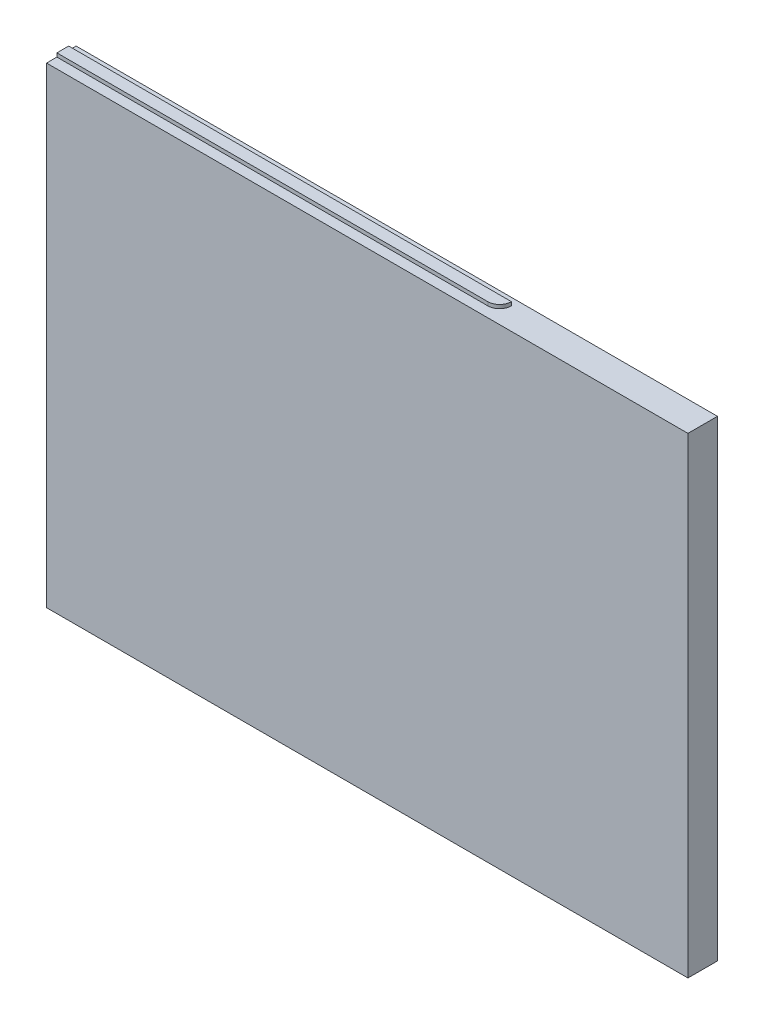
ISO-10303-21;
HEADER;
FILE_DESCRIPTION(('STEP AP214'),'2;1');
FILE_NAME('part.step','',(''),(''),'','','');
FILE_SCHEMA(('AUTOMOTIVE_DESIGN { 1 0 10303 214 1 1 1 1 }'));
ENDSEC;
DATA;
#1=APPLICATION_CONTEXT('core data for automotive mechanical design processes');
#2=APPLICATION_PROTOCOL_DEFINITION('international standard','automotive_design',2000,#1);
#3=PRODUCT_CONTEXT('',#1,'mechanical');
#4=PRODUCT('Part','Part','',(#3));
#5=PRODUCT_RELATED_PRODUCT_CATEGORY('part','',(#4));
#6=PRODUCT_DEFINITION_FORMATION('','',#4);
#7=PRODUCT_DEFINITION_CONTEXT('part definition',#1,'design');
#8=PRODUCT_DEFINITION('design','',#6,#7);
#9=PRODUCT_DEFINITION_SHAPE('','',#8);
#10=(LENGTH_UNIT() NAMED_UNIT(*) SI_UNIT(.MILLI.,.METRE.));
#11=(NAMED_UNIT(*) PLANE_ANGLE_UNIT() SI_UNIT($,.RADIAN.));
#12=(NAMED_UNIT(*) SI_UNIT($,.STERADIAN.) SOLID_ANGLE_UNIT());
#13=UNCERTAINTY_MEASURE_WITH_UNIT(LENGTH_MEASURE(1.E-05),#10,'distance_accuracy_value','');
#14=(GEOMETRIC_REPRESENTATION_CONTEXT(3) GLOBAL_UNCERTAINTY_ASSIGNED_CONTEXT((#13)) GLOBAL_UNIT_ASSIGNED_CONTEXT((#10,
#11,#12)) REPRESENTATION_CONTEXT('',''));
#15=CARTESIAN_POINT('',(0.,0.,0.));
#16=DIRECTION('',(0.,0.,1.));
#17=DIRECTION('',(1.,0.,0.));
#18=AXIS2_PLACEMENT_3D('',#15,#16,#17);
#19=CARTESIAN_POINT('',(-67.1291659251601,-122.720727580372,10.));
#20=DIRECTION('',(0.,1.,0.));
#21=DIRECTION('',(0.,0.,1.));
#22=AXIS2_PLACEMENT_3D('',#19,#20,#21);
#23=PLANE('',#22);
#24=DIRECTION('',(1.,0.,0.));
#25=VECTOR('',#24,1.);
#26=CARTESIAN_POINT('',(-67.1291659251601,-122.720727580372,2.5));
#27=LINE('',#26,#25);
#28=CARTESIAN_POINT('',(-67.1291659251601,-122.720727580372,2.5));
#29=VERTEX_POINT('',#28);
#30=CARTESIAN_POINT('',(82.8708340748399,-122.720727580372,2.5));
#31=VERTEX_POINT('',#30);
#32=EDGE_CURVE('E166',#29,#31,#27,.T.);
#33=ORIENTED_EDGE('',*,*,#32,.F.);
#34=DIRECTION('',(0.,0.,-1.));
#35=VECTOR('',#34,1.);
#36=CARTESIAN_POINT('',(-67.1291659251601,-122.720727580372,10.));
#37=LINE('',#36,#35);
#38=CARTESIAN_POINT('',(-67.1291659251601,-122.720727580372,0.));
#39=VERTEX_POINT('',#38);
#40=EDGE_CURVE('E197',#29,#39,#37,.T.);
#41=ORIENTED_EDGE('',*,*,#40,.T.);
#42=DIRECTION('',(1.,0.,0.));
#43=VECTOR('',#42,1.);
#44=CARTESIAN_POINT('',(-67.1291659251601,-122.720727580372,0.));
#45=LINE('',#44,#43);
#46=CARTESIAN_POINT('',(150.17083407484,-122.720727580372,0.));
#47=VERTEX_POINT('',#46);
#48=EDGE_CURVE('E183',#39,#47,#45,.T.);
#49=ORIENTED_EDGE('',*,*,#48,.T.);
#50=DIRECTION('',(0.,0.,-1.));
#51=VECTOR('',#50,1.);
#52=CARTESIAN_POINT('',(150.17083407484,-122.720727580372,10.));
#53=LINE('',#52,#51);
#54=CARTESIAN_POINT('',(150.17083407484,-122.720727580372,10.));
#55=VERTEX_POINT('',#54);
#56=EDGE_CURVE('E194',#55,#47,#53,.T.);
#57=ORIENTED_EDGE('',*,*,#56,.F.);
#58=DIRECTION('',(1.,0.,0.));
#59=VECTOR('',#58,1.);
#60=CARTESIAN_POINT('',(-67.1291659251601,-122.720727580372,10.));
#61=LINE('',#60,#59);
#62=CARTESIAN_POINT('',(-67.1291659251601,-122.720727580372,10.));
#63=VERTEX_POINT('',#62);
#64=EDGE_CURVE('E173',#63,#55,#61,.T.);
#65=ORIENTED_EDGE('',*,*,#64,.F.);
#66=CARTESIAN_POINT('',(-67.1291659251601,-122.720727580372,6.5));
#67=VERTEX_POINT('',#66);
#68=EDGE_CURVE('E198',#63,#67,#37,.T.);
#69=ORIENTED_EDGE('',*,*,#68,.T.);
#70=DIRECTION('',(1.,0.,0.));
#71=VECTOR('',#70,1.);
#72=CARTESIAN_POINT('',(-67.1291659251601,-122.720727580372,6.5));
#73=LINE('',#72,#71);
#74=CARTESIAN_POINT('',(78.8708340748399,-122.720727580372,6.5));
#75=VERTEX_POINT('',#74);
#76=EDGE_CURVE('E163',#67,#75,#73,.T.);
#77=ORIENTED_EDGE('',*,*,#76,.T.);
#78=CARTESIAN_POINT('',(78.8708340748399,-122.720727580372,2.5));
#79=DIRECTION('',(0.,1.,0.));
#80=DIRECTION('',(0.,0.,1.));
#81=AXIS2_PLACEMENT_3D('',#78,#79,#80);
#82=CIRCLE('',#81,4.);
#83=EDGE_CURVE('E209',#75,#31,#82,.T.);
#84=ORIENTED_EDGE('',*,*,#83,.T.);
#85=EDGE_LOOP('',(#33,#41,#49,#57,#65,#69,#77,#84));
#86=FACE_BOUND('',#85,.T.);
#87=ADVANCED_FACE('F35',(#86),#23,.F.);
#88=CARTESIAN_POINT('',(-67.1291659251601,37.0792724196278,10.));
#89=DIRECTION('',(0.,-1.,0.));
#90=DIRECTION('',(0.,0.,-1.));
#91=AXIS2_PLACEMENT_3D('',#88,#89,#90);
#92=PLANE('',#91);
#93=DIRECTION('',(-1.,0.,0.));
#94=VECTOR('',#93,1.);
#95=CARTESIAN_POINT('',(-67.1291659251601,37.0792724196278,2.5));
#96=LINE('',#95,#94);
#97=CARTESIAN_POINT('',(82.8708340748399,37.0792724196278,2.5));
#98=VERTEX_POINT('',#97);
#99=CARTESIAN_POINT('',(-67.1291659251601,37.0792724196278,2.5));
#100=VERTEX_POINT('',#99);
#101=EDGE_CURVE('E127',#98,#100,#96,.T.);
#102=ORIENTED_EDGE('',*,*,#101,.F.);
#103=CARTESIAN_POINT('',(78.8708340748399,37.0792724196278,2.5));
#104=DIRECTION('',(0.,-1.,0.));
#105=DIRECTION('',(0.,0.,-1.));
#106=AXIS2_PLACEMENT_3D('',#103,#104,#105);
#107=CIRCLE('',#106,4.);
#108=CARTESIAN_POINT('',(78.8708340748399,37.0792724196278,6.5));
#109=VERTEX_POINT('',#108);
#110=EDGE_CURVE('E11',#98,#109,#107,.T.);
#111=ORIENTED_EDGE('',*,*,#110,.T.);
#112=DIRECTION('',(-1.,0.,0.));
#113=VECTOR('',#112,1.);
#114=CARTESIAN_POINT('',(-67.1291659251601,37.0792724196278,6.5));
#115=LINE('',#114,#113);
#116=CARTESIAN_POINT('',(-67.1291659251601,37.0792724196278,6.5));
#117=VERTEX_POINT('',#116);
#118=EDGE_CURVE('E201',#109,#117,#115,.T.);
#119=ORIENTED_EDGE('',*,*,#118,.T.);
#120=DIRECTION('',(0.,0.,-1.));
#121=VECTOR('',#120,1.);
#122=CARTESIAN_POINT('',(-67.1291659251601,37.0792724196278,10.));
#123=LINE('',#122,#121);
#124=CARTESIAN_POINT('',(-67.1291659251601,37.0792724196278,10.));
#125=VERTEX_POINT('',#124);
#126=EDGE_CURVE('E189',#125,#117,#123,.T.);
#127=ORIENTED_EDGE('',*,*,#126,.F.);
#128=DIRECTION('',(-1.,0.,0.));
#129=VECTOR('',#128,1.);
#130=CARTESIAN_POINT('',(-67.1291659251601,37.0792724196278,10.));
#131=LINE('',#130,#129);
#132=CARTESIAN_POINT('',(150.17083407484,37.0792724196278,10.));
#133=VERTEX_POINT('',#132);
#134=EDGE_CURVE('E178',#133,#125,#131,.T.);
#135=ORIENTED_EDGE('',*,*,#134,.F.);
#136=DIRECTION('',(0.,0.,-1.));
#137=VECTOR('',#136,1.);
#138=CARTESIAN_POINT('',(150.17083407484,37.0792724196278,10.));
#139=LINE('',#138,#137);
#140=CARTESIAN_POINT('',(150.17083407484,37.0792724196278,0.));
#141=VERTEX_POINT('',#140);
#142=EDGE_CURVE('E191',#133,#141,#139,.T.);
#143=ORIENTED_EDGE('',*,*,#142,.T.);
#144=DIRECTION('',(-1.,0.,0.));
#145=VECTOR('',#144,1.);
#146=CARTESIAN_POINT('',(-67.1291659251601,37.0792724196278,0.));
#147=LINE('',#146,#145);
#148=CARTESIAN_POINT('',(-67.1291659251601,37.0792724196278,0.));
#149=VERTEX_POINT('',#148);
#150=EDGE_CURVE('E174',#141,#149,#147,.T.);
#151=ORIENTED_EDGE('',*,*,#150,.T.);
#152=EDGE_CURVE('E180',#100,#149,#123,.T.);
#153=ORIENTED_EDGE('',*,*,#152,.F.);
#154=EDGE_LOOP('',(#102,#111,#119,#127,#135,#143,#151,#153));
#155=FACE_BOUND('',#154,.T.);
#156=ADVANCED_FACE('F214',(#155),#92,.F.);
#157=CARTESIAN_POINT('',(-67.1291659251601,37.0792724196278,10.));
#158=DIRECTION('',(1.,0.,0.));
#159=DIRECTION('',(0.,1.,0.));
#160=AXIS2_PLACEMENT_3D('',#157,#158,#159);
#161=PLANE('',#160);
#162=ORIENTED_EDGE('',*,*,#126,.T.);
#163=DIRECTION('',(0.,1.,0.));
#164=VECTOR('',#163,1.);
#165=CARTESIAN_POINT('',(-67.1291659251601,-123.960727580372,6.5));
#166=LINE('',#165,#164);
#167=CARTESIAN_POINT('',(-67.1291659251601,38.3192724196278,6.5));
#168=VERTEX_POINT('',#167);
#169=EDGE_CURVE('E144',#117,#168,#166,.T.);
#170=ORIENTED_EDGE('',*,*,#169,.T.);
#171=DIRECTION('',(0.,0.,-1.));
#172=VECTOR('',#171,1.);
#173=CARTESIAN_POINT('',(-67.1291659251601,38.3192724196278,6.5));
#174=LINE('',#173,#172);
#175=CARTESIAN_POINT('',(-67.1291659251601,38.3192724196278,2.5));
#176=VERTEX_POINT('',#175);
#177=EDGE_CURVE('E138',#168,#176,#174,.T.);
#178=ORIENTED_EDGE('',*,*,#177,.T.);
#179=DIRECTION('',(0.,1.,0.));
#180=VECTOR('',#179,1.);
#181=CARTESIAN_POINT('',(-67.1291659251601,-123.960727580372,2.5));
#182=LINE('',#181,#180);
#183=EDGE_CURVE('E123',#100,#176,#182,.T.);
#184=ORIENTED_EDGE('',*,*,#183,.F.);
#185=ORIENTED_EDGE('',*,*,#152,.T.);
#186=DIRECTION('',(0.,-1.,0.));
#187=VECTOR('',#186,1.);
#188=CARTESIAN_POINT('',(-67.1291659251601,37.0792724196278,0.));
#189=LINE('',#188,#187);
#190=EDGE_CURVE('E169',#149,#39,#189,.T.);
#191=ORIENTED_EDGE('',*,*,#190,.T.);
#192=ORIENTED_EDGE('',*,*,#40,.F.);
#193=CARTESIAN_POINT('',(-67.1291659251601,-123.960727580372,2.5));
#194=VERTEX_POINT('',#193);
#195=EDGE_CURVE('E131',#194,#29,#182,.T.);
#196=ORIENTED_EDGE('',*,*,#195,.F.);
#197=DIRECTION('',(0.,0.,-1.));
#198=VECTOR('',#197,1.);
#199=CARTESIAN_POINT('',(-67.1291659251601,-123.960727580372,6.5));
#200=LINE('',#199,#198);
#201=CARTESIAN_POINT('',(-67.1291659251601,-123.960727580372,6.5));
#202=VERTEX_POINT('',#201);
#203=EDGE_CURVE('E149',#202,#194,#200,.T.);
#204=ORIENTED_EDGE('',*,*,#203,.F.);
#205=EDGE_CURVE('E157',#202,#67,#166,.T.);
#206=ORIENTED_EDGE('',*,*,#205,.T.);
#207=ORIENTED_EDGE('',*,*,#68,.F.);
#208=DIRECTION('',(0.,-1.,0.));
#209=VECTOR('',#208,1.);
#210=CARTESIAN_POINT('',(-67.1291659251601,37.0792724196278,10.));
#211=LINE('',#210,#209);
#212=EDGE_CURVE('E170',#125,#63,#211,.T.);
#213=ORIENTED_EDGE('',*,*,#212,.F.);
#214=EDGE_LOOP('',(#162,#170,#178,#184,#185,#191,#192,#196,#204,#206,#207,#213));
#215=FACE_BOUND('',#214,.T.);
#216=ADVANCED_FACE('F142',(#215),#161,.F.);
#217=CARTESIAN_POINT('',(150.17083407484,37.0792724196278,10.));
#218=DIRECTION('',(-1.,0.,0.));
#219=DIRECTION('',(0.,-1.,0.));
#220=AXIS2_PLACEMENT_3D('',#217,#218,#219);
#221=PLANE('',#220);
#222=DIRECTION('',(0.,1.,0.));
#223=VECTOR('',#222,1.);
#224=CARTESIAN_POINT('',(150.17083407484,37.0792724196278,0.));
#225=LINE('',#224,#223);
#226=EDGE_CURVE('E185',#47,#141,#225,.T.);
#227=ORIENTED_EDGE('',*,*,#226,.T.);
#228=ORIENTED_EDGE('',*,*,#142,.F.);
#229=DIRECTION('',(0.,1.,0.));
#230=VECTOR('',#229,1.);
#231=CARTESIAN_POINT('',(150.17083407484,37.0792724196278,10.));
#232=LINE('',#231,#230);
#233=EDGE_CURVE('E176',#55,#133,#232,.T.);
#234=ORIENTED_EDGE('',*,*,#233,.F.);
#235=ORIENTED_EDGE('',*,*,#56,.T.);
#236=EDGE_LOOP('',(#227,#228,#234,#235));
#237=FACE_BOUND('',#236,.T.);
#238=ADVANCED_FACE('F228',(#237),#221,.F.);
#239=CARTESIAN_POINT('',(0.,0.,10.));
#240=DIRECTION('',(0.,0.,1.));
#241=DIRECTION('',(1.,0.,0.));
#242=AXIS2_PLACEMENT_3D('',#239,#240,#241);
#243=PLANE('',#242);
#244=ORIENTED_EDGE('',*,*,#212,.T.);
#245=ORIENTED_EDGE('',*,*,#64,.T.);
#246=ORIENTED_EDGE('',*,*,#233,.T.);
#247=ORIENTED_EDGE('',*,*,#134,.T.);
#248=EDGE_LOOP('',(#244,#245,#246,#247));
#249=FACE_BOUND('',#248,.T.);
#250=ADVANCED_FACE('F232',(#249),#243,.T.);
#251=CARTESIAN_POINT('',(0.,0.,0.));
#252=DIRECTION('',(0.,0.,1.));
#253=DIRECTION('',(1.,0.,0.));
#254=AXIS2_PLACEMENT_3D('',#251,#252,#253);
#255=PLANE('',#254);
#256=ORIENTED_EDGE('',*,*,#190,.F.);
#257=ORIENTED_EDGE('',*,*,#150,.F.);
#258=ORIENTED_EDGE('',*,*,#226,.F.);
#259=ORIENTED_EDGE('',*,*,#48,.F.);
#260=EDGE_LOOP('',(#256,#257,#258,#259));
#261=FACE_BOUND('',#260,.T.);
#262=ADVANCED_FACE('F221',(#261),#255,.F.);
#263=CARTESIAN_POINT('',(0.,38.3192724196278,0.));
#264=DIRECTION('',(0.,-1.,0.));
#265=DIRECTION('',(0.,0.,-1.));
#266=AXIS2_PLACEMENT_3D('',#263,#264,#265);
#267=PLANE('',#266);
#268=DIRECTION('',(1.,0.,0.));
#269=VECTOR('',#268,1.);
#270=CARTESIAN_POINT('',(-67.1291659251601,38.3192724196278,6.5));
#271=LINE('',#270,#269);
#272=CARTESIAN_POINT('',(78.8708340748399,38.3192724196278,6.5));
#273=VERTEX_POINT('',#272);
#274=EDGE_CURVE('E139',#168,#273,#271,.T.);
#275=ORIENTED_EDGE('',*,*,#274,.T.);
#276=CARTESIAN_POINT('',(78.8708340748399,38.3192724196278,2.5));
#277=DIRECTION('',(0.,-1.,0.));
#278=DIRECTION('',(0.,0.,-1.));
#279=AXIS2_PLACEMENT_3D('',#276,#277,#278);
#280=CIRCLE('',#279,4.);
#281=CARTESIAN_POINT('',(82.8708340748399,38.3192724196278,2.5));
#282=VERTEX_POINT('',#281);
#283=EDGE_CURVE('E43',#273,#282,#280,.F.);
#284=ORIENTED_EDGE('',*,*,#283,.T.);
#285=DIRECTION('',(1.,0.,0.));
#286=VECTOR('',#285,1.);
#287=CARTESIAN_POINT('',(-67.1291659251601,38.3192724196278,2.5));
#288=LINE('',#287,#286);
#289=EDGE_CURVE('E126',#176,#282,#288,.T.);
#290=ORIENTED_EDGE('',*,*,#289,.F.);
#291=ORIENTED_EDGE('',*,*,#177,.F.);
#292=EDGE_LOOP('',(#275,#284,#290,#291));
#293=FACE_BOUND('',#292,.T.);
#294=ADVANCED_FACE('F137',(#293),#267,.F.);
#295=CARTESIAN_POINT('',(-67.1291659251601,-123.960727580372,6.5));
#296=DIRECTION('',(0.,0.,1.));
#297=DIRECTION('',(1.,0.,0.));
#298=AXIS2_PLACEMENT_3D('',#295,#296,#297);
#299=PLANE('',#298);
#300=ORIENTED_EDGE('',*,*,#118,.F.);
#301=DIRECTION('',(0.,1.,0.));
#302=VECTOR('',#301,1.);
#303=CARTESIAN_POINT('',(78.8708340748399,-123.960727580372,6.5));
#304=LINE('',#303,#302);
#305=EDGE_CURVE('E211',#109,#273,#304,.T.);
#306=ORIENTED_EDGE('',*,*,#305,.T.);
#307=ORIENTED_EDGE('',*,*,#274,.F.);
#308=ORIENTED_EDGE('',*,*,#169,.F.);
#309=EDGE_LOOP('',(#300,#306,#307,#308));
#310=FACE_BOUND('',#309,.T.);
#311=ADVANCED_FACE('F213',(#310),#299,.T.);
#312=CARTESIAN_POINT('',(-67.1291659251601,-123.960727580372,2.5));
#313=DIRECTION('',(0.,0.,1.));
#314=DIRECTION('',(1.,0.,0.));
#315=AXIS2_PLACEMENT_3D('',#312,#313,#314);
#316=PLANE('',#315);
#317=DIRECTION('',(0.,1.,0.));
#318=VECTOR('',#317,1.);
#319=CARTESIAN_POINT('',(82.8708340748399,-123.960727580372,2.5));
#320=LINE('',#319,#318);
#321=EDGE_CURVE('E160',#98,#282,#320,.T.);
#322=ORIENTED_EDGE('',*,*,#321,.F.);
#323=ORIENTED_EDGE('',*,*,#101,.T.);
#324=ORIENTED_EDGE('',*,*,#183,.T.);
#325=ORIENTED_EDGE('',*,*,#289,.T.);
#326=EDGE_LOOP('',(#322,#323,#324,#325));
#327=FACE_BOUND('',#326,.T.);
#328=ADVANCED_FACE('F125',(#327),#316,.F.);
#329=ORIENTED_EDGE('',*,*,#195,.T.);
#330=ORIENTED_EDGE('',*,*,#32,.T.);
#331=CARTESIAN_POINT('',(82.8708340748399,-123.960727580372,2.5));
#332=VERTEX_POINT('',#331);
#333=EDGE_CURVE('E132',#332,#31,#320,.T.);
#334=ORIENTED_EDGE('',*,*,#333,.F.);
#335=DIRECTION('',(1.,0.,0.));
#336=VECTOR('',#335,1.);
#337=CARTESIAN_POINT('',(-67.1291659251601,-123.960727580372,2.5));
#338=LINE('',#337,#336);
#339=EDGE_CURVE('E152',#194,#332,#338,.T.);
#340=ORIENTED_EDGE('',*,*,#339,.F.);
#341=EDGE_LOOP('',(#329,#330,#334,#340));
#342=FACE_BOUND('',#341,.T.);
#343=ADVANCED_FACE('F246',(#342),#316,.F.);
#344=DIRECTION('',(1.,0.,0.));
#345=VECTOR('',#344,1.);
#346=CARTESIAN_POINT('',(-67.1291659251601,-123.960727580372,6.5));
#347=LINE('',#346,#345);
#348=CARTESIAN_POINT('',(78.8708340748399,-123.960727580372,6.5));
#349=VERTEX_POINT('',#348);
#350=EDGE_CURVE('E154',#202,#349,#347,.T.);
#351=ORIENTED_EDGE('',*,*,#350,.T.);
#352=DIRECTION('',(0.,1.,0.));
#353=VECTOR('',#352,1.);
#354=CARTESIAN_POINT('',(78.8708340748399,-123.960727580372,6.5));
#355=LINE('',#354,#353);
#356=EDGE_CURVE('E204',#349,#75,#355,.T.);
#357=ORIENTED_EDGE('',*,*,#356,.T.);
#358=ORIENTED_EDGE('',*,*,#76,.F.);
#359=ORIENTED_EDGE('',*,*,#205,.F.);
#360=EDGE_LOOP('',(#351,#357,#358,#359));
#361=FACE_BOUND('',#360,.T.);
#362=ADVANCED_FACE('F239',(#361),#299,.T.);
#363=CARTESIAN_POINT('',(0.,-123.960727580372,0.));
#364=DIRECTION('',(0.,-1.,0.));
#365=DIRECTION('',(0.,0.,-1.));
#366=AXIS2_PLACEMENT_3D('',#363,#364,#365);
#367=PLANE('',#366);
#368=ORIENTED_EDGE('',*,*,#339,.T.);
#369=CARTESIAN_POINT('',(78.8708340748399,-123.960727580372,2.5));
#370=DIRECTION('',(0.,-1.,0.));
#371=DIRECTION('',(0.,0.,-1.));
#372=AXIS2_PLACEMENT_3D('',#369,#370,#371);
#373=CIRCLE('',#372,4.);
#374=EDGE_CURVE('E207',#332,#349,#373,.T.);
#375=ORIENTED_EDGE('',*,*,#374,.T.);
#376=ORIENTED_EDGE('',*,*,#350,.F.);
#377=ORIENTED_EDGE('',*,*,#203,.T.);
#378=EDGE_LOOP('',(#368,#375,#376,#377));
#379=FACE_BOUND('',#378,.T.);
#380=ADVANCED_FACE('F248',(#379),#367,.T.);
#381=CARTESIAN_POINT('',(78.8708340748399,-123.960727580372,2.5));
#382=DIRECTION('',(0.,1.,0.));
#383=DIRECTION('',(0.,0.,1.));
#384=AXIS2_PLACEMENT_3D('',#381,#382,#383);
#385=CYLINDRICAL_SURFACE('',#384,4.);
#386=ORIENTED_EDGE('',*,*,#374,.F.);
#387=ORIENTED_EDGE('',*,*,#333,.T.);
#388=ORIENTED_EDGE('',*,*,#83,.F.);
#389=ORIENTED_EDGE('',*,*,#356,.F.);
#390=EDGE_LOOP('',(#386,#387,#388,#389));
#391=FACE_BOUND('',#390,.T.);
#392=ADVANCED_FACE('F243',(#391),#385,.T.);
#393=CARTESIAN_POINT('',(78.8708340748399,-123.960727580372,2.5));
#394=DIRECTION('',(0.,1.,0.));
#395=DIRECTION('',(0.,0.,1.));
#396=AXIS2_PLACEMENT_3D('',#393,#394,#395);
#397=CYLINDRICAL_SURFACE('',#396,4.);
#398=ORIENTED_EDGE('',*,*,#110,.F.);
#399=ORIENTED_EDGE('',*,*,#321,.T.);
#400=ORIENTED_EDGE('',*,*,#283,.F.);
#401=ORIENTED_EDGE('',*,*,#305,.F.);
#402=EDGE_LOOP('',(#398,#399,#400,#401));
#403=FACE_BOUND('',#402,.T.);
#404=ADVANCED_FACE('F37',(#403),#397,.T.);
#405=CLOSED_SHELL('',(#87,#156,#216,#238,#250,#262,#294,#311,#328,#343,#362,#380,#392,#404));
#406=MANIFOLD_SOLID_BREP('B2',#405);
#407=ADVANCED_BREP_SHAPE_REPRESENTATION('',(#18,#406),#14);
#408=SHAPE_DEFINITION_REPRESENTATION(#9,#407);
ENDSEC;
END-ISO-10303-21;
